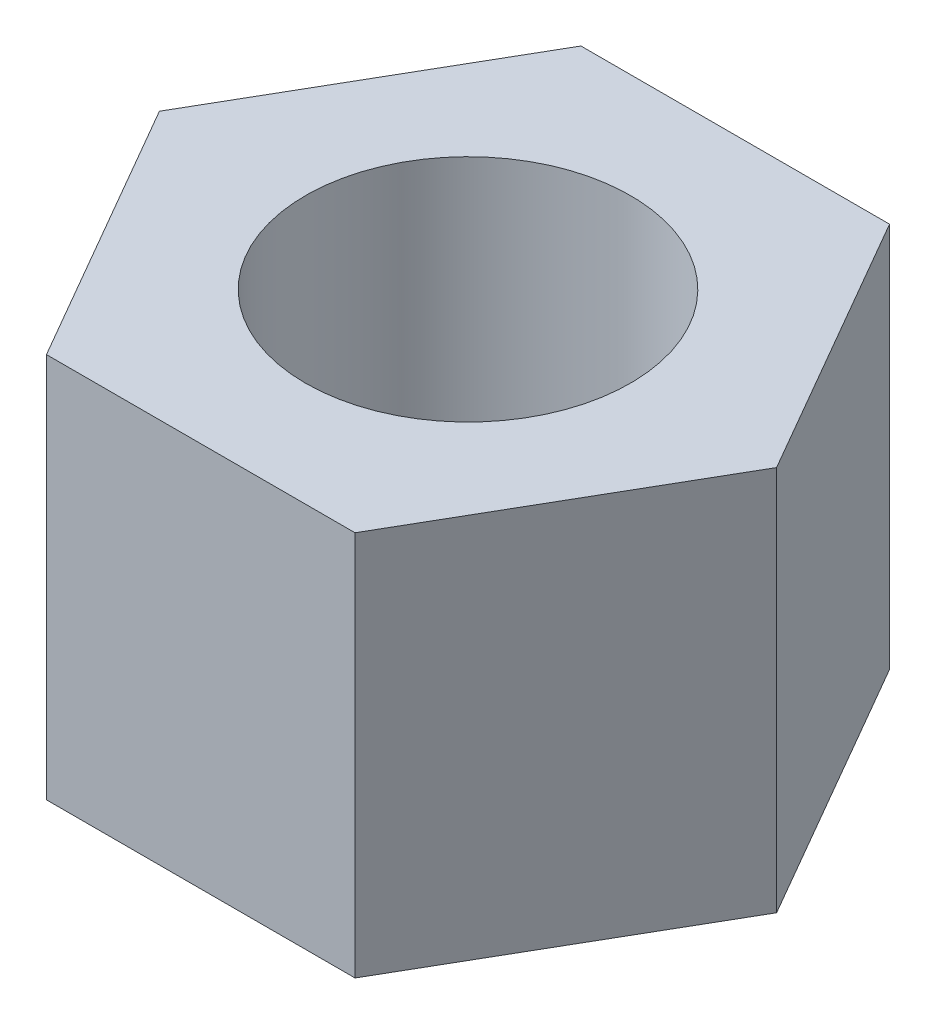
ISO-10303-21;
HEADER;
FILE_DESCRIPTION(('STEP AP214'),'2;1');
FILE_NAME('part.step','',(''),(''),'','','');
FILE_SCHEMA(('AUTOMOTIVE_DESIGN { 1 0 10303 214 1 1 1 1 }'));
ENDSEC;
DATA;
#1=APPLICATION_CONTEXT('core data for automotive mechanical design processes');
#2=APPLICATION_PROTOCOL_DEFINITION('international standard','automotive_design',2000,#1);
#3=PRODUCT_CONTEXT('',#1,'mechanical');
#4=PRODUCT('Part','Part','',(#3));
#5=PRODUCT_RELATED_PRODUCT_CATEGORY('part','',(#4));
#6=PRODUCT_DEFINITION_FORMATION('','',#4);
#7=PRODUCT_DEFINITION_CONTEXT('part definition',#1,'design');
#8=PRODUCT_DEFINITION('design','',#6,#7);
#9=PRODUCT_DEFINITION_SHAPE('','',#8);
#10=(LENGTH_UNIT() NAMED_UNIT(*) SI_UNIT(.MILLI.,.METRE.));
#11=(NAMED_UNIT(*) PLANE_ANGLE_UNIT() SI_UNIT($,.RADIAN.));
#12=(NAMED_UNIT(*) SI_UNIT($,.STERADIAN.) SOLID_ANGLE_UNIT());
#13=UNCERTAINTY_MEASURE_WITH_UNIT(LENGTH_MEASURE(1.E-05),#10,'distance_accuracy_value','');
#14=(GEOMETRIC_REPRESENTATION_CONTEXT(3) GLOBAL_UNCERTAINTY_ASSIGNED_CONTEXT((#13)) GLOBAL_UNIT_ASSIGNED_CONTEXT((#10,
#11,#12)) REPRESENTATION_CONTEXT('',''));
#15=CARTESIAN_POINT('',(0.,0.,0.));
#16=DIRECTION('',(0.,0.,1.));
#17=DIRECTION('',(1.,0.,0.));
#18=AXIS2_PLACEMENT_3D('',#15,#16,#17);
#19=CARTESIAN_POINT('',(0.,10.,0.));
#20=DIRECTION('',(0.,1.,0.));
#21=DIRECTION('',(0.,0.,1.));
#22=AXIS2_PLACEMENT_3D('',#19,#20,#21);
#23=PLANE('',#22);
#24=DIRECTION('',(0.499999999999995,0.,-0.866025403784442));
#25=VECTOR('',#24,1.);
#26=CARTESIAN_POINT('',(4.00155069707493,10.,6.93088911639625));
#27=LINE('',#26,#25);
#28=CARTESIAN_POINT('',(4.00155069707493,10.,6.93088911639625));
#29=VERTEX_POINT('',#28);
#30=CARTESIAN_POINT('',(8.0031013941497,10.,0.));
#31=VERTEX_POINT('',#30);
#32=EDGE_CURVE('E152',#29,#31,#27,.T.);
#33=ORIENTED_EDGE('',*,*,#32,.T.);
#34=DIRECTION('',(-0.500000000000001,0.,-0.866025403784438));
#35=VECTOR('',#34,1.);
#36=CARTESIAN_POINT('',(8.0031013941497,10.,0.));
#37=LINE('',#36,#35);
#38=CARTESIAN_POINT('',(4.00155069707484,10.,-6.93088911639631));
#39=VERTEX_POINT('',#38);
#40=EDGE_CURVE('E100',#31,#39,#37,.T.);
#41=ORIENTED_EDGE('',*,*,#40,.T.);
#42=DIRECTION('',(-1.,0.,0.));
#43=VECTOR('',#42,1.);
#44=CARTESIAN_POINT('',(4.00155069707484,10.,-6.93088911639631));
#45=LINE('',#44,#43);
#46=CARTESIAN_POINT('',(-4.00155069707488,10.,-6.93088911639628));
#47=VERTEX_POINT('',#46);
#48=EDGE_CURVE('E113',#39,#47,#45,.T.);
#49=ORIENTED_EDGE('',*,*,#48,.T.);
#50=DIRECTION('',(-0.499999999999995,0.,0.866025403784442));
#51=VECTOR('',#50,1.);
#52=CARTESIAN_POINT('',(-4.00155069707488,10.,-6.93088911639628));
#53=LINE('',#52,#51);
#54=CARTESIAN_POINT('',(-8.0031013941497,10.,0.));
#55=VERTEX_POINT('',#54);
#56=EDGE_CURVE('E107',#47,#55,#53,.T.);
#57=ORIENTED_EDGE('',*,*,#56,.T.);
#58=DIRECTION('',(0.500000000000007,0.,0.866025403784435));
#59=VECTOR('',#58,1.);
#60=CARTESIAN_POINT('',(-8.0031013941497,10.,0.));
#61=LINE('',#60,#59);
#62=CARTESIAN_POINT('',(-4.00155069707479,10.,6.93088911639634));
#63=VERTEX_POINT('',#62);
#64=EDGE_CURVE('E111',#55,#63,#61,.T.);
#65=ORIENTED_EDGE('',*,*,#64,.T.);
#66=DIRECTION('',(1.,0.,0.));
#67=VECTOR('',#66,1.);
#68=CARTESIAN_POINT('',(-4.00155069707479,10.,6.93088911639634));
#69=LINE('',#68,#67);
#70=EDGE_CURVE('E63',#63,#29,#69,.T.);
#71=ORIENTED_EDGE('',*,*,#70,.T.);
#72=EDGE_LOOP('',(#33,#41,#49,#57,#65,#71));
#73=FACE_BOUND('',#72,.T.);
#74=CARTESIAN_POINT('',(0.,10.,0.));
#75=DIRECTION('',(0.,1.,0.));
#76=DIRECTION('',(0.,0.,1.));
#77=AXIS2_PLACEMENT_3D('',#74,#75,#76);
#78=CIRCLE('',#77,4.215);
#79=CARTESIAN_POINT('',(0.,10.,4.215));
#80=VERTEX_POINT('',#79);
#81=EDGE_CURVE('E140',#80,#80,#78,.T.);
#82=ORIENTED_EDGE('',*,*,#81,.F.);
#83=EDGE_LOOP('',(#82));
#84=FACE_BOUND('',#83,.T.);
#85=ADVANCED_FACE('F45',(#73,#84),#23,.T.);
#86=CARTESIAN_POINT('',(0.,0.,0.));
#87=DIRECTION('',(0.,1.,0.));
#88=DIRECTION('',(0.,0.,1.));
#89=AXIS2_PLACEMENT_3D('',#86,#87,#88);
#90=PLANE('',#89);
#91=DIRECTION('',(0.499999999999995,0.,-0.866025403784442));
#92=VECTOR('',#91,1.);
#93=CARTESIAN_POINT('',(4.00155069707493,0.,6.93088911639625));
#94=LINE('',#93,#92);
#95=CARTESIAN_POINT('',(4.00155069707493,0.,6.93088911639625));
#96=VERTEX_POINT('',#95);
#97=CARTESIAN_POINT('',(8.0031013941497,0.,0.));
#98=VERTEX_POINT('',#97);
#99=EDGE_CURVE('E135',#96,#98,#94,.T.);
#100=ORIENTED_EDGE('',*,*,#99,.F.);
#101=DIRECTION('',(1.,0.,0.));
#102=VECTOR('',#101,1.);
#103=CARTESIAN_POINT('',(-4.00155069707479,0.,6.93088911639634));
#104=LINE('',#103,#102);
#105=CARTESIAN_POINT('',(-4.00155069707479,0.,6.93088911639634));
#106=VERTEX_POINT('',#105);
#107=EDGE_CURVE('E92',#106,#96,#104,.T.);
#108=ORIENTED_EDGE('',*,*,#107,.F.);
#109=DIRECTION('',(0.500000000000007,0.,0.866025403784435));
#110=VECTOR('',#109,1.);
#111=CARTESIAN_POINT('',(-8.0031013941497,0.,0.));
#112=LINE('',#111,#110);
#113=CARTESIAN_POINT('',(-8.0031013941497,0.,0.));
#114=VERTEX_POINT('',#113);
#115=EDGE_CURVE('E86',#114,#106,#112,.T.);
#116=ORIENTED_EDGE('',*,*,#115,.F.);
#117=DIRECTION('',(-0.499999999999995,0.,0.866025403784442));
#118=VECTOR('',#117,1.);
#119=CARTESIAN_POINT('',(-4.00155069707488,0.,-6.93088911639628));
#120=LINE('',#119,#118);
#121=CARTESIAN_POINT('',(-4.00155069707488,0.,-6.93088911639628));
#122=VERTEX_POINT('',#121);
#123=EDGE_CURVE('E122',#122,#114,#120,.T.);
#124=ORIENTED_EDGE('',*,*,#123,.F.);
#125=DIRECTION('',(-1.,0.,0.));
#126=VECTOR('',#125,1.);
#127=CARTESIAN_POINT('',(4.00155069707484,0.,-6.93088911639631));
#128=LINE('',#127,#126);
#129=CARTESIAN_POINT('',(4.00155069707484,0.,-6.93088911639631));
#130=VERTEX_POINT('',#129);
#131=EDGE_CURVE('E143',#130,#122,#128,.T.);
#132=ORIENTED_EDGE('',*,*,#131,.F.);
#133=DIRECTION('',(-0.500000000000001,0.,-0.866025403784438));
#134=VECTOR('',#133,1.);
#135=CARTESIAN_POINT('',(8.0031013941497,0.,0.));
#136=LINE('',#135,#134);
#137=EDGE_CURVE('E139',#98,#130,#136,.T.);
#138=ORIENTED_EDGE('',*,*,#137,.F.);
#139=EDGE_LOOP('',(#100,#108,#116,#124,#132,#138));
#140=FACE_BOUND('',#139,.T.);
#141=CARTESIAN_POINT('',(0.,0.,0.));
#142=DIRECTION('',(0.,1.,0.));
#143=DIRECTION('',(0.,0.,1.));
#144=AXIS2_PLACEMENT_3D('',#141,#142,#143);
#145=CIRCLE('',#144,4.215);
#146=CARTESIAN_POINT('',(0.,0.,4.215));
#147=VERTEX_POINT('',#146);
#148=EDGE_CURVE('E249',#147,#147,#145,.T.);
#149=ORIENTED_EDGE('',*,*,#148,.T.);
#150=EDGE_LOOP('',(#149));
#151=FACE_BOUND('',#150,.T.);
#152=ADVANCED_FACE('F165',(#140,#151),#90,.F.);
#153=CARTESIAN_POINT('',(4.00155069707493,10.,6.93088911639625));
#154=DIRECTION('',(-0.866025403784442,0.,-0.499999999999995));
#155=DIRECTION('',(-0.499999999999995,0.,0.866025403784442));
#156=AXIS2_PLACEMENT_3D('',#153,#154,#155);
#157=PLANE('',#156);
#158=ORIENTED_EDGE('',*,*,#99,.T.);
#159=DIRECTION('',(0.,-1.,0.));
#160=VECTOR('',#159,1.);
#161=CARTESIAN_POINT('',(8.0031013941497,10.,0.));
#162=LINE('',#161,#160);
#163=EDGE_CURVE('E11',#31,#98,#162,.T.);
#164=ORIENTED_EDGE('',*,*,#163,.F.);
#165=ORIENTED_EDGE('',*,*,#32,.F.);
#166=DIRECTION('',(0.,-1.,0.));
#167=VECTOR('',#166,1.);
#168=CARTESIAN_POINT('',(4.00155069707493,10.,6.93088911639625));
#169=LINE('',#168,#167);
#170=EDGE_CURVE('E131',#29,#96,#169,.T.);
#171=ORIENTED_EDGE('',*,*,#170,.T.);
#172=EDGE_LOOP('',(#158,#164,#165,#171));
#173=FACE_BOUND('',#172,.T.);
#174=ADVANCED_FACE('F47',(#173),#157,.F.);
#175=CARTESIAN_POINT('',(8.0031013941497,10.,0.));
#176=DIRECTION('',(-0.866025403784438,0.,0.500000000000001));
#177=DIRECTION('',(0.500000000000001,0.,0.866025403784438));
#178=AXIS2_PLACEMENT_3D('',#175,#176,#177);
#179=PLANE('',#178);
#180=ORIENTED_EDGE('',*,*,#137,.T.);
#181=DIRECTION('',(0.,-1.,0.));
#182=VECTOR('',#181,1.);
#183=CARTESIAN_POINT('',(4.00155069707484,10.,-6.93088911639631));
#184=LINE('',#183,#182);
#185=EDGE_CURVE('E55',#39,#130,#184,.T.);
#186=ORIENTED_EDGE('',*,*,#185,.F.);
#187=ORIENTED_EDGE('',*,*,#40,.F.);
#188=ORIENTED_EDGE('',*,*,#163,.T.);
#189=EDGE_LOOP('',(#180,#186,#187,#188));
#190=FACE_BOUND('',#189,.T.);
#191=ADVANCED_FACE('F190',(#190),#179,.F.);
#192=CARTESIAN_POINT('',(4.00155069707484,10.,-6.93088911639631));
#193=DIRECTION('',(0.,0.,1.));
#194=DIRECTION('',(1.,0.,0.));
#195=AXIS2_PLACEMENT_3D('',#192,#193,#194);
#196=PLANE('',#195);
#197=ORIENTED_EDGE('',*,*,#131,.T.);
#198=DIRECTION('',(0.,-1.,0.));
#199=VECTOR('',#198,1.);
#200=CARTESIAN_POINT('',(-4.00155069707488,10.,-6.93088911639628));
#201=LINE('',#200,#199);
#202=EDGE_CURVE('E124',#47,#122,#201,.T.);
#203=ORIENTED_EDGE('',*,*,#202,.F.);
#204=ORIENTED_EDGE('',*,*,#48,.F.);
#205=ORIENTED_EDGE('',*,*,#185,.T.);
#206=EDGE_LOOP('',(#197,#203,#204,#205));
#207=FACE_BOUND('',#206,.T.);
#208=ADVANCED_FACE('F162',(#207),#196,.F.);
#209=CARTESIAN_POINT('',(-4.00155069707488,10.,-6.93088911639628));
#210=DIRECTION('',(0.866025403784442,0.,0.499999999999995));
#211=DIRECTION('',(0.499999999999995,0.,-0.866025403784442));
#212=AXIS2_PLACEMENT_3D('',#209,#210,#211);
#213=PLANE('',#212);
#214=ORIENTED_EDGE('',*,*,#123,.T.);
#215=DIRECTION('',(0.,-1.,0.));
#216=VECTOR('',#215,1.);
#217=CARTESIAN_POINT('',(-8.0031013941497,10.,0.));
#218=LINE('',#217,#216);
#219=EDGE_CURVE('E119',#55,#114,#218,.T.);
#220=ORIENTED_EDGE('',*,*,#219,.F.);
#221=ORIENTED_EDGE('',*,*,#56,.F.);
#222=ORIENTED_EDGE('',*,*,#202,.T.);
#223=EDGE_LOOP('',(#214,#220,#221,#222));
#224=FACE_BOUND('',#223,.T.);
#225=ADVANCED_FACE('F120',(#224),#213,.F.);
#226=CARTESIAN_POINT('',(-8.0031013941497,10.,0.));
#227=DIRECTION('',(0.866025403784435,0.,-0.500000000000007));
#228=DIRECTION('',(-0.500000000000007,0.,-0.866025403784435));
#229=AXIS2_PLACEMENT_3D('',#226,#227,#228);
#230=PLANE('',#229);
#231=ORIENTED_EDGE('',*,*,#115,.T.);
#232=DIRECTION('',(0.,-1.,0.));
#233=VECTOR('',#232,1.);
#234=CARTESIAN_POINT('',(-4.00155069707479,10.,6.93088911639634));
#235=LINE('',#234,#233);
#236=EDGE_CURVE('E125',#63,#106,#235,.T.);
#237=ORIENTED_EDGE('',*,*,#236,.F.);
#238=ORIENTED_EDGE('',*,*,#64,.F.);
#239=ORIENTED_EDGE('',*,*,#219,.T.);
#240=EDGE_LOOP('',(#231,#237,#238,#239));
#241=FACE_BOUND('',#240,.T.);
#242=ADVANCED_FACE('F127',(#241),#230,.F.);
#243=CARTESIAN_POINT('',(-4.00155069707479,10.,6.93088911639634));
#244=DIRECTION('',(0.,0.,-1.));
#245=DIRECTION('',(-1.,0.,0.));
#246=AXIS2_PLACEMENT_3D('',#243,#244,#245);
#247=PLANE('',#246);
#248=ORIENTED_EDGE('',*,*,#107,.T.);
#249=ORIENTED_EDGE('',*,*,#170,.F.);
#250=ORIENTED_EDGE('',*,*,#70,.F.);
#251=ORIENTED_EDGE('',*,*,#236,.T.);
#252=EDGE_LOOP('',(#248,#249,#250,#251));
#253=FACE_BOUND('',#252,.T.);
#254=ADVANCED_FACE('F170',(#253),#247,.F.);
#255=CARTESIAN_POINT('',(0.,10.,0.));
#256=DIRECTION('',(0.,-1.,0.));
#257=DIRECTION('',(0.,0.,-1.));
#258=AXIS2_PLACEMENT_3D('',#255,#256,#257);
#259=CYLINDRICAL_SURFACE('',#258,4.215);
#260=ORIENTED_EDGE('',*,*,#81,.T.);
#261=EDGE_LOOP('',(#260));
#262=FACE_BOUND('',#261,.T.);
#263=ORIENTED_EDGE('',*,*,#148,.F.);
#264=EDGE_LOOP('',(#263));
#265=FACE_BOUND('',#264,.T.);
#266=ADVANCED_FACE('F172',(#262,#265),#259,.F.);
#267=CLOSED_SHELL('',(#85,#152,#174,#191,#208,#225,#242,#254,#266));
#268=MANIFOLD_SOLID_BREP('B2',#267);
#269=ADVANCED_BREP_SHAPE_REPRESENTATION('',(#18,#268),#14);
#270=SHAPE_DEFINITION_REPRESENTATION(#9,#269);
ENDSEC;
END-ISO-10303-21;
